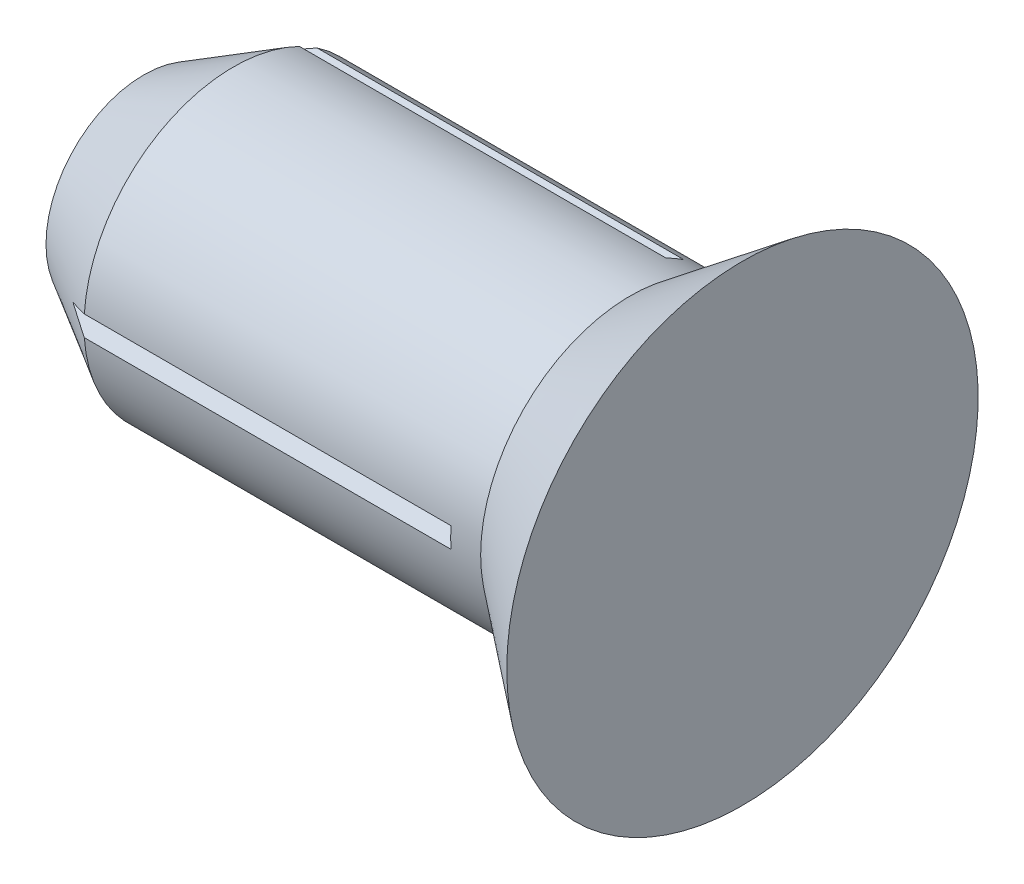
ISO-10303-21;
HEADER;
FILE_DESCRIPTION(('STEP AP214'),'2;1');
FILE_NAME('part.step','',(''),(''),'','','');
FILE_SCHEMA(('AUTOMOTIVE_DESIGN { 1 0 10303 214 1 1 1 1 }'));
ENDSEC;
DATA;
#1=APPLICATION_CONTEXT('core data for automotive mechanical design processes');
#2=APPLICATION_PROTOCOL_DEFINITION('international standard','automotive_design',2000,#1);
#3=PRODUCT_CONTEXT('',#1,'mechanical');
#4=PRODUCT('Part','Part','',(#3));
#5=PRODUCT_RELATED_PRODUCT_CATEGORY('part','',(#4));
#6=PRODUCT_DEFINITION_FORMATION('','',#4);
#7=PRODUCT_DEFINITION_CONTEXT('part definition',#1,'design');
#8=PRODUCT_DEFINITION('design','',#6,#7);
#9=PRODUCT_DEFINITION_SHAPE('','',#8);
#10=(LENGTH_UNIT() NAMED_UNIT(*) SI_UNIT(.MILLI.,.METRE.));
#11=(NAMED_UNIT(*) PLANE_ANGLE_UNIT() SI_UNIT($,.RADIAN.));
#12=(NAMED_UNIT(*) SI_UNIT($,.STERADIAN.) SOLID_ANGLE_UNIT());
#13=UNCERTAINTY_MEASURE_WITH_UNIT(LENGTH_MEASURE(1.E-05),#10,'distance_accuracy_value','');
#14=(GEOMETRIC_REPRESENTATION_CONTEXT(3) GLOBAL_UNCERTAINTY_ASSIGNED_CONTEXT((#13)) GLOBAL_UNIT_ASSIGNED_CONTEXT((#10,
#11,#12)) REPRESENTATION_CONTEXT('',''));
#15=CARTESIAN_POINT('',(0.,0.,0.));
#16=DIRECTION('',(0.,0.,1.));
#17=DIRECTION('',(1.,0.,0.));
#18=AXIS2_PLACEMENT_3D('',#15,#16,#17);
#19=CARTESIAN_POINT('',(7.49354589383691,15.75,0.));
#20=DIRECTION('',(-1.,0.,0.));
#21=DIRECTION('',(0.,0.,1.));
#22=AXIS2_PLACEMENT_3D('',#19,#20,#21);
#23=PLANE('',#22);
#24=CARTESIAN_POINT('',(7.49354589383691,0.,0.));
#25=DIRECTION('',(-1.,0.,0.));
#26=DIRECTION('',(0.,0.,1.));
#27=AXIS2_PLACEMENT_3D('',#24,#25,#26);
#28=CIRCLE('',#27,15.75);
#29=CARTESIAN_POINT('',(7.49354589383691,0.,15.75));
#30=VERTEX_POINT('',#29);
#31=EDGE_CURVE('E160',#30,#30,#28,.T.);
#32=ORIENTED_EDGE('',*,*,#31,.F.);
#33=EDGE_LOOP('',(#32));
#34=FACE_BOUND('',#33,.T.);
#35=ADVANCED_FACE('F32',(#34),#23,.F.);
#36=CARTESIAN_POINT('',(7.49354589383691,0.,0.));
#37=DIRECTION('',(1.,0.,0.));
#38=DIRECTION('',(0.,0.,-1.));
#39=AXIS2_PLACEMENT_3D('',#36,#37,#38);
#40=CONICAL_SURFACE('',#39,15.75,0.654498469497875);
#41=CARTESIAN_POINT('',(0.,0.,0.));
#42=DIRECTION('',(-1.,0.,0.));
#43=DIRECTION('',(0.,0.,1.));
#44=AXIS2_PLACEMENT_3D('',#41,#42,#43);
#45=CIRCLE('',#44,10.);
#46=CARTESIAN_POINT('',(0.,0.,10.));
#47=VERTEX_POINT('',#46);
#48=EDGE_CURVE('E156',#47,#47,#45,.T.);
#49=ORIENTED_EDGE('',*,*,#48,.F.);
#50=EDGE_LOOP('',(#49));
#51=FACE_BOUND('',#50,.T.);
#52=ORIENTED_EDGE('',*,*,#31,.T.);
#53=EDGE_LOOP('',(#52));
#54=FACE_BOUND('',#53,.T.);
#55=ADVANCED_FACE('F204',(#51,#54),#40,.T.);
#56=CARTESIAN_POINT('',(-40.,0.,0.));
#57=DIRECTION('',(-1.,0.,0.));
#58=DIRECTION('',(0.,0.,1.));
#59=AXIS2_PLACEMENT_3D('',#56,#57,#58);
#60=CYLINDRICAL_SURFACE('',#59,10.);
#61=CARTESIAN_POINT('',(-2.00000001160387,0.,0.));
#62=DIRECTION('',(-1.,0.,0.));
#63=DIRECTION('',(0.,0.,1.));
#64=AXIS2_PLACEMENT_3D('',#61,#62,#63);
#65=CIRCLE('',#64,10.);
#66=CARTESIAN_POINT('',(-2.00000001160387,8.98189101971242,-4.39609300515917));
#67=VERTEX_POINT('',#66);
#68=CARTESIAN_POINT('',(-2.00000001160387,8.29807372972323,-5.58049929451453));
#69=VERTEX_POINT('',#68);
#70=EDGE_CURVE('E11',#67,#69,#65,.T.);
#71=ORIENTED_EDGE('',*,*,#70,.F.);
#72=DIRECTION('',(-1.,0.,0.));
#73=VECTOR('',#72,1.);
#74=CARTESIAN_POINT('',(-40.,8.98189101971242,-4.39609300515917));
#75=LINE('',#74,#73);
#76=CARTESIAN_POINT('',(-26.5064541061631,8.98189101971242,-4.39609300515917));
#77=VERTEX_POINT('',#76);
#78=EDGE_CURVE('E118',#67,#77,#75,.T.);
#79=ORIENTED_EDGE('',*,*,#78,.T.);
#80=CARTESIAN_POINT('',(-26.5064541061631,0.,0.));
#81=DIRECTION('',(-1.,0.,0.));
#82=DIRECTION('',(0.,0.,1.));
#83=AXIS2_PLACEMENT_3D('',#80,#81,#82);
#84=CIRCLE('',#83,10.);
#85=CARTESIAN_POINT('',(-26.5064541061631,0.683817289989198,9.97659229967386));
#86=VERTEX_POINT('',#85);
#87=EDGE_CURVE('E153',#86,#77,#84,.T.);
#88=ORIENTED_EDGE('',*,*,#87,.F.);
#89=DIRECTION('',(-1.,0.,0.));
#90=VECTOR('',#89,1.);
#91=CARTESIAN_POINT('',(-40.,0.683817289989198,9.97659229967386));
#92=LINE('',#91,#90);
#93=CARTESIAN_POINT('',(-2.00000001160387,0.683817289989199,9.97659229967386));
#94=VERTEX_POINT('',#93);
#95=EDGE_CURVE('E143',#86,#94,#92,.F.);
#96=ORIENTED_EDGE('',*,*,#95,.T.);
#97=CARTESIAN_POINT('',(-2.00000001160387,0.,0.));
#98=DIRECTION('',(-1.,0.,0.));
#99=DIRECTION('',(0.,0.,1.));
#100=AXIS2_PLACEMENT_3D('',#97,#98,#99);
#101=CIRCLE('',#100,10.);
#102=CARTESIAN_POINT('',(-2.00000001160387,-0.683817289989198,9.97659229967386));
#103=VERTEX_POINT('',#102);
#104=EDGE_CURVE('E232',#103,#94,#101,.T.);
#105=ORIENTED_EDGE('',*,*,#104,.F.);
#106=DIRECTION('',(-1.,0.,0.));
#107=VECTOR('',#106,1.);
#108=CARTESIAN_POINT('',(-40.,-0.683817289989197,9.97659229967386));
#109=LINE('',#108,#107);
#110=CARTESIAN_POINT('',(-26.5064541061631,-0.683817289989198,9.97659229967386));
#111=VERTEX_POINT('',#110);
#112=EDGE_CURVE('E146',#103,#111,#109,.T.);
#113=ORIENTED_EDGE('',*,*,#112,.T.);
#114=CARTESIAN_POINT('',(-26.5064541061631,-8.98189101971236,-4.3960930051593));
#115=VERTEX_POINT('',#114);
#116=EDGE_CURVE('E152',#115,#111,#84,.T.);
#117=ORIENTED_EDGE('',*,*,#116,.F.);
#118=DIRECTION('',(-1.,0.,0.));
#119=VECTOR('',#118,1.);
#120=CARTESIAN_POINT('',(-40.,-8.98189101971236,-4.3960930051593));
#121=LINE('',#120,#119);
#122=CARTESIAN_POINT('',(-2.00000001160387,-8.98189101971236,-4.3960930051593));
#123=VERTEX_POINT('',#122);
#124=EDGE_CURVE('E54',#115,#123,#121,.F.);
#125=ORIENTED_EDGE('',*,*,#124,.T.);
#126=CARTESIAN_POINT('',(-2.00000001160387,0.,0.));
#127=DIRECTION('',(-1.,0.,0.));
#128=DIRECTION('',(0.,0.,1.));
#129=AXIS2_PLACEMENT_3D('',#126,#127,#128);
#130=CIRCLE('',#129,10.);
#131=CARTESIAN_POINT('',(-2.00000001160387,-8.29807372972316,-5.58049929451465));
#132=VERTEX_POINT('',#131);
#133=EDGE_CURVE('E261',#132,#123,#130,.T.);
#134=ORIENTED_EDGE('',*,*,#133,.F.);
#135=DIRECTION('',(-1.,0.,0.));
#136=VECTOR('',#135,1.);
#137=CARTESIAN_POINT('',(-40.,-8.29807372972316,-5.58049929451464));
#138=LINE('',#137,#136);
#139=CARTESIAN_POINT('',(-26.5064541061631,-8.29807372972316,-5.58049929451465));
#140=VERTEX_POINT('',#139);
#141=EDGE_CURVE('E132',#132,#140,#138,.T.);
#142=ORIENTED_EDGE('',*,*,#141,.T.);
#143=CARTESIAN_POINT('',(-26.5064541061631,8.29807372972323,-5.58049929451453));
#144=VERTEX_POINT('',#143);
#145=EDGE_CURVE('E157',#144,#140,#84,.T.);
#146=ORIENTED_EDGE('',*,*,#145,.F.);
#147=DIRECTION('',(-1.,0.,0.));
#148=VECTOR('',#147,1.);
#149=CARTESIAN_POINT('',(-40.,8.29807372972323,-5.58049929451453));
#150=LINE('',#149,#148);
#151=EDGE_CURVE('E46',#144,#69,#150,.F.);
#152=ORIENTED_EDGE('',*,*,#151,.T.);
#153=EDGE_LOOP('',(#71,#79,#88,#96,#105,#113,#117,#125,#134,#142,#146,#152));
#154=FACE_BOUND('',#153,.T.);
#155=ORIENTED_EDGE('',*,*,#48,.T.);
#156=EDGE_LOOP('',(#155));
#157=FACE_BOUND('',#156,.T.);
#158=ADVANCED_FACE('F201',(#154,#157),#60,.T.);
#159=CARTESIAN_POINT('',(-26.5064541061631,0.,0.));
#160=DIRECTION('',(1.,0.,0.));
#161=DIRECTION('',(0.,0.,-1.));
#162=AXIS2_PLACEMENT_3D('',#159,#160,#161);
#163=CONICAL_SURFACE('',#162,10.,0.523598775598301);
#164=CARTESIAN_POINT('',(-32.5064541061631,0.,0.));
#165=DIRECTION('',(-1.,0.,0.));
#166=DIRECTION('',(0.,0.,1.));
#167=AXIS2_PLACEMENT_3D('',#164,#165,#166);
#168=CIRCLE('',#167,6.53589838486223);
#169=CARTESIAN_POINT('',(-32.5064541061631,0.,6.53589838486223));
#170=VERTEX_POINT('',#169);
#171=EDGE_CURVE('E149',#170,#170,#168,.T.);
#172=ORIENTED_EDGE('',*,*,#171,.F.);
#173=EDGE_LOOP('',(#172));
#174=FACE_BOUND('',#173,.T.);
#175=ORIENTED_EDGE('',*,*,#87,.T.);
#176=CARTESIAN_POINT('',(-26.5062541061631,8.98202532937215,-4.39608125458654));
#177=CARTESIAN_POINT('',(-26.6515926077001,8.88442165387174,-4.40462046971129));
#178=CARTESIAN_POINT('',(-26.7967256801637,8.78651373635347,-4.41318630256357));
#179=CARTESIAN_POINT('',(-27.0865272132736,8.59002629577401,-4.4303767261395));
#180=CARTESIAN_POINT('',(-27.2311956862956,8.49144679082423,-4.43900131527861));
#181=CARTESIAN_POINT('',(-27.5200226850796,8.29354740294665,-4.45631526823662));
#182=CARTESIAN_POINT('',(-27.6641812087039,8.19422751692059,-4.46500463232659));
#183=CARTESIAN_POINT('',(-27.951929029266,7.99476476117973,-4.48245536224955));
#184=CARTESIAN_POINT('',(-28.0955183108007,7.89462186941733,-4.49121673001147));
#185=CARTESIAN_POINT('',(-28.2387897589749,7.79402863405999,-4.50001749773263));
#186=B_SPLINE_CURVE_WITH_KNOTS('',3,(#176,#177,#178,#179,#180,#181,#182,#183,#184,#185),
.UNSPECIFIED.,.F.,.F.,(4,2,2,2,4),(0.,0.525836702973484,1.05165928083962,1.57748406033221,
2.10332297241807),.UNSPECIFIED.);
#187=CARTESIAN_POINT('',(-28.238504913732,7.79422863405999,-4.49999999999993));
#188=VERTEX_POINT('',#187);
#189=EDGE_CURVE('E39',#77,#188,#186,.T.);
#190=ORIENTED_EDGE('',*,*,#189,.T.);
#191=CARTESIAN_POINT('',(-28.2388180095685,7.79413537252836,-4.49979999999993));
#192=CARTESIAN_POINT('',(-28.0955442491615,7.8368110283531,-4.59131823925337));
#193=CARTESIAN_POINT('',(-27.9519526425939,7.87929562620335,-4.68242675335829));
#194=CARTESIAN_POINT('',(-27.6642001501043,7.96391565343207,-4.86389498736399));
#195=CARTESIAN_POINT('',(-27.5200392795867,8.00605109216458,-4.95425472732457));
#196=CARTESIAN_POINT('',(-27.2312075685049,8.09000786321399,-5.13430060386365));
#197=CARTESIAN_POINT('',(-27.0865367300786,8.13182919684538,-5.2239867432611));
#198=CARTESIAN_POINT('',(-26.7967304499896,8.21518695272154,-5.40274802761568));
#199=CARTESIAN_POINT('',(-26.6515949959503,8.25672336728229,-5.49182315609436));
#200=CARTESIAN_POINT('',(-26.5062541061632,8.29813070825876,-5.58062148537829));
#201=B_SPLINE_CURVE_WITH_KNOTS('',3,(#191,#192,#193,#194,#195,#196,#197,#198,#199,#200),
.UNSPECIFIED.,.F.,.F.,(4,2,2,2,4),(0.,0.525847553163815,1.05168097293757,1.57751219092272,
2.10335753481119),.UNSPECIFIED.);
#202=EDGE_CURVE('E111',#188,#144,#201,.T.);
#203=ORIENTED_EDGE('',*,*,#202,.T.);
#204=ORIENTED_EDGE('',*,*,#145,.T.);
#205=CARTESIAN_POINT('',(-26.5062541061631,-8.29813070825861,-5.58062148537826));
#206=CARTESIAN_POINT('',(-26.6515949959503,-8.25672336728219,-5.49182315609443));
#207=CARTESIAN_POINT('',(-26.7967304499896,-8.21518695272146,-5.40274802761578));
#208=CARTESIAN_POINT('',(-27.0865367300786,-8.13182919684531,-5.22398674326123));
#209=CARTESIAN_POINT('',(-27.2312075685049,-8.09000786321392,-5.13430060386376));
#210=CARTESIAN_POINT('',(-27.5200392795867,-8.00605109216451,-4.95425472732468));
#211=CARTESIAN_POINT('',(-27.6642001501043,-7.963915653432,-4.8638949873641));
#212=CARTESIAN_POINT('',(-27.9519526425939,-7.87929562620328,-4.6824267533584));
#213=CARTESIAN_POINT('',(-28.0955442491615,-7.83681102835304,-4.59131823925349));
#214=CARTESIAN_POINT('',(-28.2388180095685,-7.7941353725283,-4.49980000000004));
#215=B_SPLINE_CURVE_WITH_KNOTS('',3,(#205,#206,#207,#208,#209,#210,#211,#212,#213,#214),
.UNSPECIFIED.,.F.,.F.,(4,2,2,2,4),(0.,0.525845343888468,1.05167656187362,1.57750998164737,
2.10335753481119),.UNSPECIFIED.);
#216=CARTESIAN_POINT('',(-28.238504913732,-7.79422863405993,-4.50000000000004));
#217=VERTEX_POINT('',#216);
#218=EDGE_CURVE('E235',#140,#217,#215,.T.);
#219=ORIENTED_EDGE('',*,*,#218,.T.);
#220=CARTESIAN_POINT('',(-28.2387897589749,-7.79402863405993,-4.50001749773274));
#221=CARTESIAN_POINT('',(-28.0955183108007,-7.89462186941727,-4.49121673001158));
#222=CARTESIAN_POINT('',(-27.951929029266,-7.99476476117967,-4.48245536224967));
#223=CARTESIAN_POINT('',(-27.6641812087039,-8.19422751692053,-4.4650046323267));
#224=CARTESIAN_POINT('',(-27.5200226850796,-8.29354740294659,-4.45631526823674));
#225=CARTESIAN_POINT('',(-27.2311956862956,-8.49144679082416,-4.43900131527873));
#226=CARTESIAN_POINT('',(-27.0865272132736,-8.59002629577393,-4.43037672613963));
#227=CARTESIAN_POINT('',(-26.7967256801637,-8.78651373635342,-4.4131863025637));
#228=CARTESIAN_POINT('',(-26.6515926077001,-8.88442165387173,-4.40462046971141));
#229=CARTESIAN_POINT('',(-26.5062541061632,-8.98202532937224,-4.39608125458666));
#230=B_SPLINE_CURVE_WITH_KNOTS('',3,(#220,#221,#222,#223,#224,#225,#226,#227,#228,#229),
.UNSPECIFIED.,.F.,.F.,(4,2,2,2,4),(0.,0.525838912085856,1.05166369157844,1.57748626944458,
2.10332297241806),.UNSPECIFIED.);
#231=EDGE_CURVE('E229',#217,#115,#230,.T.);
#232=ORIENTED_EDGE('',*,*,#231,.T.);
#233=ORIENTED_EDGE('',*,*,#116,.T.);
#234=CARTESIAN_POINT('',(-26.5062541061631,-0.683894621113468,9.97670273996485));
#235=CARTESIAN_POINT('',(-26.6515978121198,-0.627695593648228,9.89644221090952));
#236=CARTESIAN_POINT('',(-26.7967360744582,-0.57132138111321,9.81593149164598));
#237=CARTESIAN_POINT('',(-27.0865479520748,-0.458186238500076,9.65435776323055));
#238=CARTESIAN_POINT('',(-27.2312215797307,-0.401425318851617,9.57329476897375));
#239=CARTESIAN_POINT('',(-27.5200588474439,-0.287477160579627,9.41055993386568));
#240=CARTESIAN_POINT('',(-27.6642224853629,-0.230289920171866,9.32888809046625));
#241=CARTESIAN_POINT('',(-27.9519804868789,-0.1154415529616,9.16486762375732));
#242=CARTESIAN_POINT('',(-28.0955748350699,-0.0577804134626599,9.08251898231543));
#243=CARTESIAN_POINT('',(-28.2388513220063,0.000140041507640925,8.9998));
#244=B_SPLINE_CURVE_WITH_KNOTS('',3,(#234,#235,#236,#237,#238,#239,#240,#241,#242,#243),
.UNSPECIFIED.,.F.,.F.,(4,2,2,2,4),(0.,0.525855533056181,1.05169693927041,1.57754054746446,
2.10339828998816),.UNSPECIFIED.);
#245=CARTESIAN_POINT('',(-28.238504913732,0.,9.));
#246=VERTEX_POINT('',#245);
#247=EDGE_CURVE('E171',#111,#246,#244,.T.);
#248=ORIENTED_EDGE('',*,*,#247,.T.);
#249=CARTESIAN_POINT('',(-28.2388513220063,-0.000140041507642325,8.9998));
#250=CARTESIAN_POINT('',(-28.0955748350699,0.0577804134626598,9.08251898231543));
#251=CARTESIAN_POINT('',(-27.9519804868789,0.115441552961605,9.16486762375733));
#252=CARTESIAN_POINT('',(-27.6642224853629,0.230289920171879,9.32888809046627));
#253=CARTESIAN_POINT('',(-27.5200588474438,0.287477160579645,9.4105599338657));
#254=CARTESIAN_POINT('',(-27.2312215797307,0.401425318851636,9.57329476897378));
#255=CARTESIAN_POINT('',(-27.0865479520747,0.458186238500091,9.65435776323057));
#256=CARTESIAN_POINT('',(-26.7967360744581,0.571321381113249,9.81593149164603));
#257=CARTESIAN_POINT('',(-26.6515978121198,0.627695593648295,9.89644221090962));
#258=CARTESIAN_POINT('',(-26.5062541061631,0.683894621113595,9.97670273996503));
#259=B_SPLINE_CURVE_WITH_KNOTS('',3,(#249,#250,#251,#252,#253,#254,#255,#256,#257,#258),
.UNSPECIFIED.,.F.,.F.,(4,2,2,2,4),(0.,0.525857742523736,1.05170135071781,1.57754275693207,
2.10339828998828),.UNSPECIFIED.);
#260=EDGE_CURVE('E163',#246,#86,#259,.T.);
#261=ORIENTED_EDGE('',*,*,#260,.T.);
#262=EDGE_LOOP('',(#175,#190,#203,#204,#219,#232,#233,#248,#261));
#263=FACE_BOUND('',#262,.T.);
#264=ADVANCED_FACE('F177',(#174,#263),#163,.T.);
#265=CARTESIAN_POINT('',(-32.5064541061631,0.,0.));
#266=DIRECTION('',(1.,0.,0.));
#267=DIRECTION('',(0.,0.,-1.));
#268=AXIS2_PLACEMENT_3D('',#265,#266,#267);
#269=PLANE('',#268);
#270=ORIENTED_EDGE('',*,*,#171,.T.);
#271=EDGE_LOOP('',(#270));
#272=FACE_BOUND('',#271,.T.);
#273=ADVANCED_FACE('F193',(#272),#269,.F.);
#274=CARTESIAN_POINT('',(-2.00000001160387,0.,9.));
#275=DIRECTION('',(-1.,0.,0.));
#276=DIRECTION('',(0.,0.,1.));
#277=AXIS2_PLACEMENT_3D('',#274,#275,#276);
#278=PLANE('',#277);
#279=ORIENTED_EDGE('',*,*,#104,.T.);
#280=DIRECTION('',(0.,-0.573576436351047,-0.819152044288991));
#281=VECTOR('',#280,1.);
#282=CARTESIAN_POINT('',(-2.00000001160387,0.,9.));
#283=LINE('',#282,#281);
#284=CARTESIAN_POINT('',(-2.00000001160387,0.,9.));
#285=VERTEX_POINT('',#284);
#286=EDGE_CURVE('E138',#94,#285,#283,.T.);
#287=ORIENTED_EDGE('',*,*,#286,.T.);
#288=DIRECTION('',(0.,-0.573576436351047,0.819152044288991));
#289=VECTOR('',#288,1.);
#290=CARTESIAN_POINT('',(-2.00000001160387,0.,9.));
#291=LINE('',#290,#289);
#292=EDGE_CURVE('E135',#285,#103,#291,.T.);
#293=ORIENTED_EDGE('',*,*,#292,.T.);
#294=EDGE_LOOP('',(#279,#287,#293));
#295=FACE_BOUND('',#294,.T.);
#296=ADVANCED_FACE('F188',(#295),#278,.T.);
#297=CARTESIAN_POINT('',(-2.00000001160387,0.,9.));
#298=DIRECTION('',(0.,-0.819152044288991,-0.573576436351047));
#299=DIRECTION('',(0.,0.573576436351047,-0.819152044288991));
#300=AXIS2_PLACEMENT_3D('',#297,#298,#299);
#301=PLANE('',#300);
#302=ORIENTED_EDGE('',*,*,#292,.F.);
#303=DIRECTION('',(-1.,0.,0.));
#304=VECTOR('',#303,1.);
#305=CARTESIAN_POINT('',(-2.00000001160387,0.,9.));
#306=LINE('',#305,#304);
#307=EDGE_CURVE('E140',#285,#246,#306,.T.);
#308=ORIENTED_EDGE('',*,*,#307,.T.);
#309=ORIENTED_EDGE('',*,*,#247,.F.);
#310=ORIENTED_EDGE('',*,*,#112,.F.);
#311=EDGE_LOOP('',(#302,#308,#309,#310));
#312=FACE_BOUND('',#311,.T.);
#313=ADVANCED_FACE('F186',(#312),#301,.F.);
#314=CARTESIAN_POINT('',(-2.00000001160387,0.,9.));
#315=DIRECTION('',(0.,0.819152044288991,-0.573576436351048));
#316=DIRECTION('',(0.,0.573576436351048,0.819152044288991));
#317=AXIS2_PLACEMENT_3D('',#314,#315,#316);
#318=PLANE('',#317);
#319=ORIENTED_EDGE('',*,*,#260,.F.);
#320=ORIENTED_EDGE('',*,*,#307,.F.);
#321=ORIENTED_EDGE('',*,*,#286,.F.);
#322=ORIENTED_EDGE('',*,*,#95,.F.);
#323=EDGE_LOOP('',(#319,#320,#321,#322));
#324=FACE_BOUND('',#323,.T.);
#325=ADVANCED_FACE('F181',(#324),#318,.F.);
#326=CARTESIAN_POINT('',(-2.00000001160387,-7.79422863405993,-4.50000000000004));
#327=DIRECTION('',(-1.,0.,0.));
#328=DIRECTION('',(0.,-0.866025403784436,-0.500000000000004));
#329=AXIS2_PLACEMENT_3D('',#326,#327,#328);
#330=PLANE('',#329);
#331=DIRECTION('',(0.,-0.422618261740694,-0.906307787036653));
#332=VECTOR('',#331,1.);
#333=CARTESIAN_POINT('',(-2.00000001160387,-7.79422863405993,-4.50000000000004));
#334=LINE('',#333,#332);
#335=CARTESIAN_POINT('',(-2.00000001160387,-7.79422863405993,-4.50000000000004));
#336=VERTEX_POINT('',#335);
#337=EDGE_CURVE('E123',#336,#132,#334,.T.);
#338=ORIENTED_EDGE('',*,*,#337,.T.);
#339=ORIENTED_EDGE('',*,*,#133,.T.);
#340=DIRECTION('',(0.,0.996194698091746,-0.0871557427476553));
#341=VECTOR('',#340,1.);
#342=CARTESIAN_POINT('',(-2.00000001160387,-7.79422863405993,-4.50000000000004));
#343=LINE('',#342,#341);
#344=EDGE_CURVE('E126',#123,#336,#343,.T.);
#345=ORIENTED_EDGE('',*,*,#344,.T.);
#346=EDGE_LOOP('',(#338,#339,#345));
#347=FACE_BOUND('',#346,.T.);
#348=ADVANCED_FACE('F185',(#347),#330,.T.);
#349=CARTESIAN_POINT('',(-2.00000001160387,-7.79422863405993,-4.50000000000004));
#350=DIRECTION('',(0.,0.906307787036653,-0.422618261740694));
#351=DIRECTION('',(0.,0.422618261740694,0.906307787036653));
#352=AXIS2_PLACEMENT_3D('',#349,#350,#351);
#353=PLANE('',#352);
#354=ORIENTED_EDGE('',*,*,#337,.F.);
#355=DIRECTION('',(-1.,0.,0.));
#356=VECTOR('',#355,1.);
#357=CARTESIAN_POINT('',(-2.00000001160387,-7.79422863405993,-4.50000000000004));
#358=LINE('',#357,#356);
#359=EDGE_CURVE('E128',#336,#217,#358,.T.);
#360=ORIENTED_EDGE('',*,*,#359,.T.);
#361=ORIENTED_EDGE('',*,*,#218,.F.);
#362=ORIENTED_EDGE('',*,*,#141,.F.);
#363=EDGE_LOOP('',(#354,#360,#361,#362));
#364=FACE_BOUND('',#363,.T.);
#365=ADVANCED_FACE('F250',(#364),#353,.F.);
#366=CARTESIAN_POINT('',(-2.00000001160387,-7.79422863405993,-4.50000000000004));
#367=DIRECTION('',(0.,0.0871557427476553,0.996194698091746));
#368=DIRECTION('',(0.,-0.996194698091746,0.0871557427476553));
#369=AXIS2_PLACEMENT_3D('',#366,#367,#368);
#370=PLANE('',#369);
#371=ORIENTED_EDGE('',*,*,#231,.F.);
#372=ORIENTED_EDGE('',*,*,#359,.F.);
#373=ORIENTED_EDGE('',*,*,#344,.F.);
#374=ORIENTED_EDGE('',*,*,#124,.F.);
#375=EDGE_LOOP('',(#371,#372,#373,#374));
#376=FACE_BOUND('',#375,.T.);
#377=ADVANCED_FACE('F246',(#376),#370,.F.);
#378=CARTESIAN_POINT('',(-2.00000001160387,7.79422863405999,-4.49999999999993));
#379=DIRECTION('',(-1.,0.,0.));
#380=DIRECTION('',(0.,0.866025403784443,-0.499999999999992));
#381=AXIS2_PLACEMENT_3D('',#378,#379,#380);
#382=PLANE('',#381);
#383=DIRECTION('',(0.,0.996194698091744,0.0871557427476688));
#384=VECTOR('',#383,1.);
#385=CARTESIAN_POINT('',(-2.00000001160387,7.79422863405999,-4.49999999999993));
#386=LINE('',#385,#384);
#387=CARTESIAN_POINT('',(-2.00000001160387,7.79422863405999,-4.49999999999993));
#388=VERTEX_POINT('',#387);
#389=EDGE_CURVE('E106',#388,#67,#386,.T.);
#390=ORIENTED_EDGE('',*,*,#389,.T.);
#391=ORIENTED_EDGE('',*,*,#70,.T.);
#392=DIRECTION('',(0.,-0.422618261740706,0.906307787036647));
#393=VECTOR('',#392,1.);
#394=CARTESIAN_POINT('',(-2.00000001160387,7.79422863405999,-4.49999999999993));
#395=LINE('',#394,#393);
#396=EDGE_CURVE('E102',#69,#388,#395,.T.);
#397=ORIENTED_EDGE('',*,*,#396,.T.);
#398=EDGE_LOOP('',(#390,#391,#397));
#399=FACE_BOUND('',#398,.T.);
#400=ADVANCED_FACE('F104',(#399),#382,.T.);
#401=CARTESIAN_POINT('',(-2.00000001160387,7.79422863405999,-4.49999999999993));
#402=DIRECTION('',(0.,-0.0871557427476688,0.996194698091745));
#403=DIRECTION('',(0.,-0.996194698091745,-0.0871557427476688));
#404=AXIS2_PLACEMENT_3D('',#401,#402,#403);
#405=PLANE('',#404);
#406=ORIENTED_EDGE('',*,*,#389,.F.);
#407=DIRECTION('',(-1.,0.,0.));
#408=VECTOR('',#407,1.);
#409=CARTESIAN_POINT('',(-2.00000001160387,7.79422863405999,-4.49999999999993));
#410=LINE('',#409,#408);
#411=EDGE_CURVE('E107',#388,#188,#410,.T.);
#412=ORIENTED_EDGE('',*,*,#411,.T.);
#413=ORIENTED_EDGE('',*,*,#189,.F.);
#414=ORIENTED_EDGE('',*,*,#78,.F.);
#415=EDGE_LOOP('',(#406,#412,#413,#414));
#416=FACE_BOUND('',#415,.T.);
#417=ADVANCED_FACE('F116',(#416),#405,.F.);
#418=CARTESIAN_POINT('',(-2.00000001160387,7.79422863405999,-4.49999999999993));
#419=DIRECTION('',(0.,-0.906307787036647,-0.422618261740706));
#420=DIRECTION('',(0.,0.422618261740706,-0.906307787036647));
#421=AXIS2_PLACEMENT_3D('',#418,#419,#420);
#422=PLANE('',#421);
#423=ORIENTED_EDGE('',*,*,#202,.F.);
#424=ORIENTED_EDGE('',*,*,#411,.F.);
#425=ORIENTED_EDGE('',*,*,#396,.F.);
#426=ORIENTED_EDGE('',*,*,#151,.F.);
#427=EDGE_LOOP('',(#423,#424,#425,#426));
#428=FACE_BOUND('',#427,.T.);
#429=ADVANCED_FACE('F110',(#428),#422,.F.);
#430=CLOSED_SHELL('',(#35,#55,#158,#264,#273,#296,#313,#325,#348,#365,#377,#400,#417,#429));
#431=MANIFOLD_SOLID_BREP('B2',#430);
#432=ADVANCED_BREP_SHAPE_REPRESENTATION('',(#18,#431),#14);
#433=SHAPE_DEFINITION_REPRESENTATION(#9,#432);
ENDSEC;
END-ISO-10303-21;
